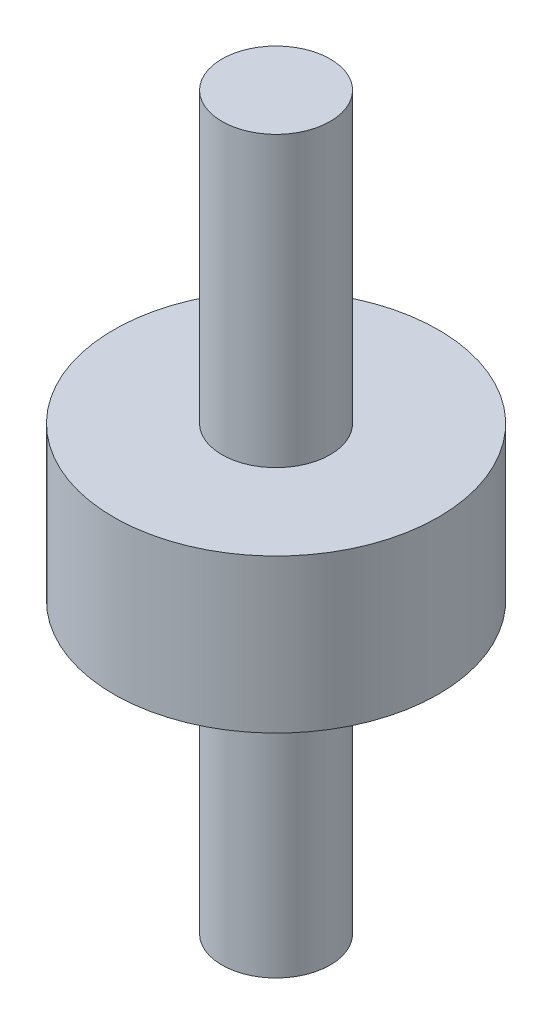
ISO-10303-21;
HEADER;
FILE_DESCRIPTION(('STEP AP214'),'2;1');
FILE_NAME('part.step','',(''),(''),'','','');
FILE_SCHEMA(('AUTOMOTIVE_DESIGN { 1 0 10303 214 1 1 1 1 }'));
ENDSEC;
DATA;
#1=APPLICATION_CONTEXT('core data for automotive mechanical design processes');
#2=APPLICATION_PROTOCOL_DEFINITION('international standard','automotive_design',2000,#1);
#3=PRODUCT_CONTEXT('',#1,'mechanical');
#4=PRODUCT('Part','Part','',(#3));
#5=PRODUCT_RELATED_PRODUCT_CATEGORY('part','',(#4));
#6=PRODUCT_DEFINITION_FORMATION('','',#4);
#7=PRODUCT_DEFINITION_CONTEXT('part definition',#1,'design');
#8=PRODUCT_DEFINITION('design','',#6,#7);
#9=PRODUCT_DEFINITION_SHAPE('','',#8);
#10=(LENGTH_UNIT() NAMED_UNIT(*) SI_UNIT(.MILLI.,.METRE.));
#11=(NAMED_UNIT(*) PLANE_ANGLE_UNIT() SI_UNIT($,.RADIAN.));
#12=(NAMED_UNIT(*) SI_UNIT($,.STERADIAN.) SOLID_ANGLE_UNIT());
#13=UNCERTAINTY_MEASURE_WITH_UNIT(LENGTH_MEASURE(1.E-05),#10,'distance_accuracy_value','');
#14=(GEOMETRIC_REPRESENTATION_CONTEXT(3) GLOBAL_UNCERTAINTY_ASSIGNED_CONTEXT((#13)) GLOBAL_UNIT_ASSIGNED_CONTEXT((#10,
#11,#12)) REPRESENTATION_CONTEXT('',''));
#15=CARTESIAN_POINT('',(0.,0.,0.));
#16=DIRECTION('',(0.,0.,1.));
#17=DIRECTION('',(1.,0.,0.));
#18=AXIS2_PLACEMENT_3D('',#15,#16,#17);
#19=CARTESIAN_POINT('',(0.,40.5,0.));
#20=DIRECTION('',(0.,-1.,0.));
#21=DIRECTION('',(1.,0.,0.));
#22=AXIS2_PLACEMENT_3D('',#19,#20,#21);
#23=PLANE('',#22);
#24=CARTESIAN_POINT('',(0.,40.5,0.));
#25=DIRECTION('',(0.,-1.,0.));
#26=DIRECTION('',(1.,0.,0.));
#27=AXIS2_PLACEMENT_3D('',#24,#25,#26);
#28=CIRCLE('',#27,3.);
#29=CARTESIAN_POINT('',(3.,40.5,0.));
#30=VERTEX_POINT('',#29);
#31=EDGE_CURVE('E10',#30,#30,#28,.T.);
#32=ORIENTED_EDGE('',*,*,#31,.F.);
#33=EDGE_LOOP('',(#32));
#34=FACE_BOUND('',#33,.T.);
#35=ADVANCED_FACE('F39',(#34),#23,.F.);
#36=CARTESIAN_POINT('',(0.,0.,0.));
#37=DIRECTION('',(0.,-1.,0.));
#38=DIRECTION('',(1.,0.,0.));
#39=AXIS2_PLACEMENT_3D('',#36,#37,#38);
#40=CYLINDRICAL_SURFACE('',#39,3.);
#41=CARTESIAN_POINT('',(0.,24.5,0.));
#42=DIRECTION('',(0.,-1.,0.));
#43=DIRECTION('',(1.,0.,0.));
#44=AXIS2_PLACEMENT_3D('',#41,#42,#43);
#45=CIRCLE('',#44,3.);
#46=CARTESIAN_POINT('',(3.,24.5,0.));
#47=VERTEX_POINT('',#46);
#48=EDGE_CURVE('E46',#47,#47,#45,.T.);
#49=ORIENTED_EDGE('',*,*,#48,.F.);
#50=EDGE_LOOP('',(#49));
#51=FACE_BOUND('',#50,.T.);
#52=ORIENTED_EDGE('',*,*,#31,.T.);
#53=EDGE_LOOP('',(#52));
#54=FACE_BOUND('',#53,.T.);
#55=ADVANCED_FACE('F93',(#51,#54),#40,.T.);
#56=CARTESIAN_POINT('',(-3.,24.5,0.));
#57=DIRECTION('',(0.,-1.,0.));
#58=DIRECTION('',(1.,0.,0.));
#59=AXIS2_PLACEMENT_3D('',#56,#57,#58);
#60=PLANE('',#59);
#61=CARTESIAN_POINT('',(0.,24.5,0.));
#62=DIRECTION('',(0.,-1.,0.));
#63=DIRECTION('',(1.,0.,0.));
#64=AXIS2_PLACEMENT_3D('',#61,#62,#63);
#65=CIRCLE('',#64,9.);
#66=CARTESIAN_POINT('',(9.,24.5,0.));
#67=VERTEX_POINT('',#66);
#68=EDGE_CURVE('E51',#67,#67,#65,.T.);
#69=ORIENTED_EDGE('',*,*,#68,.F.);
#70=EDGE_LOOP('',(#69));
#71=FACE_BOUND('',#70,.T.);
#72=ORIENTED_EDGE('',*,*,#48,.T.);
#73=EDGE_LOOP('',(#72));
#74=FACE_BOUND('',#73,.T.);
#75=ADVANCED_FACE('F88',(#71,#74),#60,.F.);
#76=CARTESIAN_POINT('',(0.,0.,0.));
#77=DIRECTION('',(0.,-1.,0.));
#78=DIRECTION('',(1.,0.,0.));
#79=AXIS2_PLACEMENT_3D('',#76,#77,#78);
#80=CYLINDRICAL_SURFACE('',#79,9.);
#81=CARTESIAN_POINT('',(0.,16.,0.));
#82=DIRECTION('',(0.,-1.,0.));
#83=DIRECTION('',(1.,0.,0.));
#84=AXIS2_PLACEMENT_3D('',#81,#82,#83);
#85=CIRCLE('',#84,9.);
#86=CARTESIAN_POINT('',(9.,16.,0.));
#87=VERTEX_POINT('',#86);
#88=EDGE_CURVE('E56',#87,#87,#85,.T.);
#89=ORIENTED_EDGE('',*,*,#88,.F.);
#90=EDGE_LOOP('',(#89));
#91=FACE_BOUND('',#90,.T.);
#92=ORIENTED_EDGE('',*,*,#68,.T.);
#93=EDGE_LOOP('',(#92));
#94=FACE_BOUND('',#93,.T.);
#95=ADVANCED_FACE('F82',(#91,#94),#80,.T.);
#96=CARTESIAN_POINT('',(-9.,16.,0.));
#97=DIRECTION('',(0.,1.,0.));
#98=DIRECTION('',(-1.,0.,0.));
#99=AXIS2_PLACEMENT_3D('',#96,#97,#98);
#100=PLANE('',#99);
#101=CARTESIAN_POINT('',(0.,16.,0.));
#102=DIRECTION('',(0.,-1.,0.));
#103=DIRECTION('',(1.,0.,0.));
#104=AXIS2_PLACEMENT_3D('',#101,#102,#103);
#105=CIRCLE('',#104,3.);
#106=CARTESIAN_POINT('',(3.,16.,0.));
#107=VERTEX_POINT('',#106);
#108=EDGE_CURVE('E62',#107,#107,#105,.T.);
#109=ORIENTED_EDGE('',*,*,#108,.F.);
#110=EDGE_LOOP('',(#109));
#111=FACE_BOUND('',#110,.T.);
#112=ORIENTED_EDGE('',*,*,#88,.T.);
#113=EDGE_LOOP('',(#112));
#114=FACE_BOUND('',#113,.T.);
#115=ADVANCED_FACE('F76',(#111,#114),#100,.F.);
#116=CARTESIAN_POINT('',(0.,0.,0.));
#117=DIRECTION('',(0.,-1.,0.));
#118=DIRECTION('',(1.,0.,0.));
#119=AXIS2_PLACEMENT_3D('',#116,#117,#118);
#120=CYLINDRICAL_SURFACE('',#119,3.);
#121=CARTESIAN_POINT('',(0.,0.,0.));
#122=DIRECTION('',(0.,-1.,0.));
#123=DIRECTION('',(1.,0.,0.));
#124=AXIS2_PLACEMENT_3D('',#121,#122,#123);
#125=CIRCLE('',#124,3.);
#126=CARTESIAN_POINT('',(3.,0.,0.));
#127=VERTEX_POINT('',#126);
#128=EDGE_CURVE('E66',#127,#127,#125,.T.);
#129=ORIENTED_EDGE('',*,*,#128,.F.);
#130=EDGE_LOOP('',(#129));
#131=FACE_BOUND('',#130,.T.);
#132=ORIENTED_EDGE('',*,*,#108,.T.);
#133=EDGE_LOOP('',(#132));
#134=FACE_BOUND('',#133,.T.);
#135=ADVANCED_FACE('F73',(#131,#134),#120,.T.);
#136=CARTESIAN_POINT('',(-3.,0.,0.));
#137=DIRECTION('',(0.,1.,0.));
#138=DIRECTION('',(-1.,0.,0.));
#139=AXIS2_PLACEMENT_3D('',#136,#137,#138);
#140=PLANE('',#139);
#141=ORIENTED_EDGE('',*,*,#128,.T.);
#142=EDGE_LOOP('',(#141));
#143=FACE_BOUND('',#142,.T.);
#144=ADVANCED_FACE('F71',(#143),#140,.F.);
#145=CLOSED_SHELL('',(#35,#55,#75,#95,#115,#135,#144));
#146=MANIFOLD_SOLID_BREP('B2',#145);
#147=ADVANCED_BREP_SHAPE_REPRESENTATION('',(#18,#146),#14);
#148=SHAPE_DEFINITION_REPRESENTATION(#9,#147);
ENDSEC;
END-ISO-10303-21;
